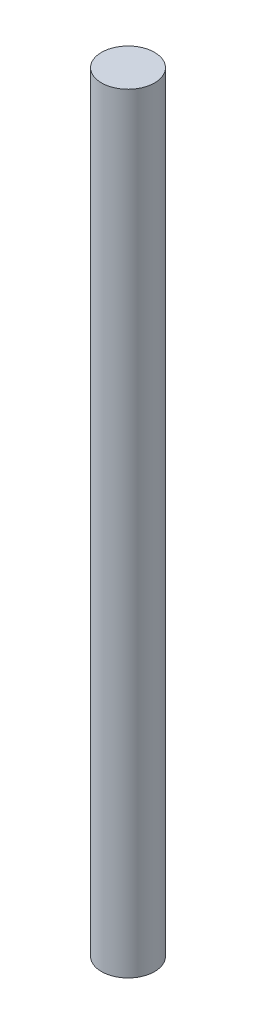
ISO-10303-21;
HEADER;
FILE_DESCRIPTION(('STEP AP214'),'2;1');
FILE_NAME('part.step','',(''),(''),'','','');
FILE_SCHEMA(('AUTOMOTIVE_DESIGN { 1 0 10303 214 1 1 1 1 }'));
ENDSEC;
DATA;
#1=APPLICATION_CONTEXT('core data for automotive mechanical design processes');
#2=APPLICATION_PROTOCOL_DEFINITION('international standard','automotive_design',2000,#1);
#3=PRODUCT_CONTEXT('',#1,'mechanical');
#4=PRODUCT('Part','Part','',(#3));
#5=PRODUCT_RELATED_PRODUCT_CATEGORY('part','',(#4));
#6=PRODUCT_DEFINITION_FORMATION('','',#4);
#7=PRODUCT_DEFINITION_CONTEXT('part definition',#1,'design');
#8=PRODUCT_DEFINITION('design','',#6,#7);
#9=PRODUCT_DEFINITION_SHAPE('','',#8);
#10=(LENGTH_UNIT() NAMED_UNIT(*) SI_UNIT(.MILLI.,.METRE.));
#11=(NAMED_UNIT(*) PLANE_ANGLE_UNIT() SI_UNIT($,.RADIAN.));
#12=(NAMED_UNIT(*) SI_UNIT($,.STERADIAN.) SOLID_ANGLE_UNIT());
#13=UNCERTAINTY_MEASURE_WITH_UNIT(LENGTH_MEASURE(1.E-05),#10,'distance_accuracy_value','');
#14=(GEOMETRIC_REPRESENTATION_CONTEXT(3) GLOBAL_UNCERTAINTY_ASSIGNED_CONTEXT((#13)) GLOBAL_UNIT_ASSIGNED_CONTEXT((#10,
#11,#12)) REPRESENTATION_CONTEXT('',''));
#15=CARTESIAN_POINT('',(0.,0.,0.));
#16=DIRECTION('',(0.,0.,1.));
#17=DIRECTION('',(1.,0.,0.));
#18=AXIS2_PLACEMENT_3D('',#15,#16,#17);
#19=CARTESIAN_POINT('',(0.,50.8,0.));
#20=DIRECTION('',(0.,-1.,0.));
#21=DIRECTION('',(0.,0.,1.));
#22=AXIS2_PLACEMENT_3D('',#19,#20,#21);
#23=CYLINDRICAL_SURFACE('',#22,1.750000056);
#24=CARTESIAN_POINT('',(0.,50.8,0.));
#25=DIRECTION('',(0.,-1.,0.));
#26=DIRECTION('',(0.,0.,-1.));
#27=AXIS2_PLACEMENT_3D('',#24,#25,#26);
#28=CIRCLE('',#27,1.750000056);
#29=CARTESIAN_POINT('',(0.,50.8,-1.750000056));
#30=VERTEX_POINT('',#29);
#31=EDGE_CURVE('E10',#30,#30,#28,.T.);
#32=ORIENTED_EDGE('',*,*,#31,.T.);
#33=EDGE_LOOP('',(#32));
#34=FACE_BOUND('',#33,.T.);
#35=CARTESIAN_POINT('',(0.,0.,0.));
#36=DIRECTION('',(0.,-1.,0.));
#37=DIRECTION('',(0.,0.,-1.));
#38=AXIS2_PLACEMENT_3D('',#35,#36,#37);
#39=CIRCLE('',#38,1.750000056);
#40=CARTESIAN_POINT('',(0.,0.,-1.750000056));
#41=VERTEX_POINT('',#40);
#42=EDGE_CURVE('E44',#41,#41,#39,.T.);
#43=ORIENTED_EDGE('',*,*,#42,.F.);
#44=EDGE_LOOP('',(#43));
#45=FACE_BOUND('',#44,.T.);
#46=ADVANCED_FACE('F41',(#34,#45),#23,.T.);
#47=CARTESIAN_POINT('',(0.,50.8,0.));
#48=DIRECTION('',(0.,1.,0.));
#49=DIRECTION('',(0.,0.,-1.));
#50=AXIS2_PLACEMENT_3D('',#47,#48,#49);
#51=PLANE('',#50);
#52=ORIENTED_EDGE('',*,*,#31,.F.);
#53=EDGE_LOOP('',(#52));
#54=FACE_BOUND('',#53,.T.);
#55=ADVANCED_FACE('F56',(#54),#51,.T.);
#56=CARTESIAN_POINT('',(0.,0.,0.));
#57=DIRECTION('',(0.,1.,0.));
#58=DIRECTION('',(0.,0.,-1.));
#59=AXIS2_PLACEMENT_3D('',#56,#57,#58);
#60=PLANE('',#59);
#61=ORIENTED_EDGE('',*,*,#42,.T.);
#62=EDGE_LOOP('',(#61));
#63=FACE_BOUND('',#62,.T.);
#64=ADVANCED_FACE('F53',(#63),#60,.F.);
#65=CLOSED_SHELL('',(#46,#55,#64));
#66=MANIFOLD_SOLID_BREP('B2',#65);
#67=ADVANCED_BREP_SHAPE_REPRESENTATION('',(#18,#66),#14);
#68=SHAPE_DEFINITION_REPRESENTATION(#9,#67);
ENDSEC;
END-ISO-10303-21;
